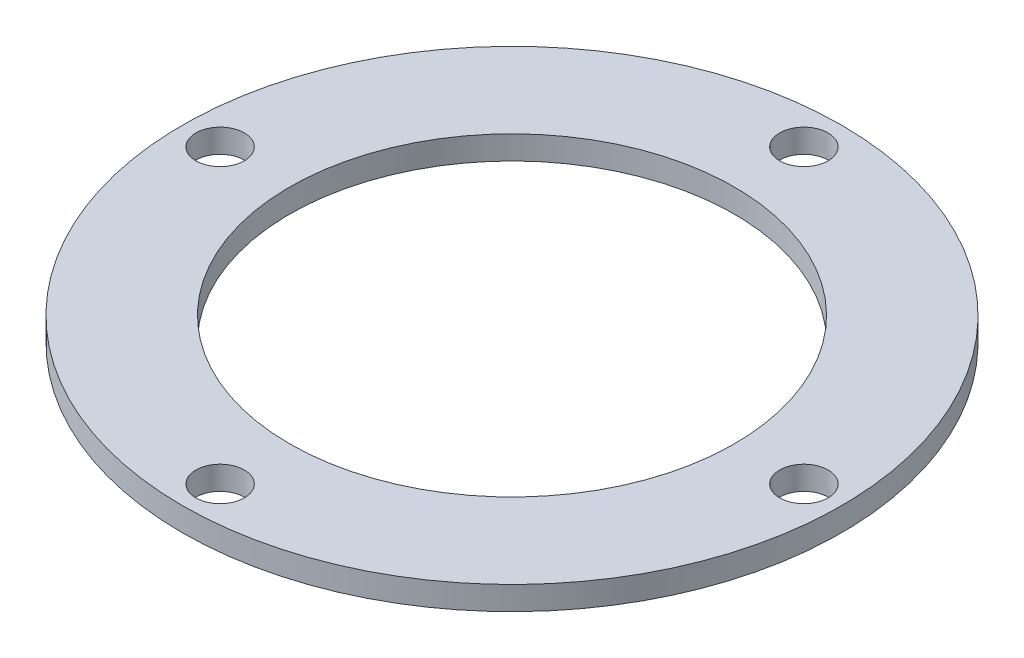
ISO-10303-21;
HEADER;
FILE_DESCRIPTION(('STEP AP214'),'2;1');
FILE_NAME('part.step','',(''),(''),'','','');
FILE_SCHEMA(('AUTOMOTIVE_DESIGN { 1 0 10303 214 1 1 1 1 }'));
ENDSEC;
DATA;
#1=APPLICATION_CONTEXT('core data for automotive mechanical design processes');
#2=APPLICATION_PROTOCOL_DEFINITION('international standard','automotive_design',2000,#1);
#3=PRODUCT_CONTEXT('',#1,'mechanical');
#4=PRODUCT('Part','Part','',(#3));
#5=PRODUCT_RELATED_PRODUCT_CATEGORY('part','',(#4));
#6=PRODUCT_DEFINITION_FORMATION('','',#4);
#7=PRODUCT_DEFINITION_CONTEXT('part definition',#1,'design');
#8=PRODUCT_DEFINITION('design','',#6,#7);
#9=PRODUCT_DEFINITION_SHAPE('','',#8);
#10=(LENGTH_UNIT() NAMED_UNIT(*) SI_UNIT(.MILLI.,.METRE.));
#11=(NAMED_UNIT(*) PLANE_ANGLE_UNIT() SI_UNIT($,.RADIAN.));
#12=(NAMED_UNIT(*) SI_UNIT($,.STERADIAN.) SOLID_ANGLE_UNIT());
#13=UNCERTAINTY_MEASURE_WITH_UNIT(LENGTH_MEASURE(1.E-05),#10,'distance_accuracy_value','');
#14=(GEOMETRIC_REPRESENTATION_CONTEXT(3) GLOBAL_UNCERTAINTY_ASSIGNED_CONTEXT((#13)) GLOBAL_UNIT_ASSIGNED_CONTEXT((#10,
#11,#12)) REPRESENTATION_CONTEXT('',''));
#15=CARTESIAN_POINT('',(0.,0.,0.));
#16=DIRECTION('',(0.,0.,1.));
#17=DIRECTION('',(1.,0.,0.));
#18=AXIS2_PLACEMENT_3D('',#15,#16,#17);
#19=CARTESIAN_POINT('',(0.,3.175,0.));
#20=DIRECTION('',(0.,1.,0.));
#21=DIRECTION('',(0.,0.,1.));
#22=AXIS2_PLACEMENT_3D('',#19,#20,#21);
#23=PLANE('',#22);
#24=CARTESIAN_POINT('',(0.,3.175,39.37));
#25=DIRECTION('',(0.,1.,0.));
#26=DIRECTION('',(0.,0.,1.));
#27=AXIS2_PLACEMENT_3D('',#24,#25,#26);
#28=CIRCLE('',#27,3.2639);
#29=CARTESIAN_POINT('',(0.,3.175,42.6339));
#30=VERTEX_POINT('',#29);
#31=EDGE_CURVE('E59',#30,#30,#28,.T.);
#32=ORIENTED_EDGE('',*,*,#31,.F.);
#33=EDGE_LOOP('',(#32));
#34=FACE_BOUND('',#33,.T.);
#35=CARTESIAN_POINT('',(0.,3.175,-39.37));
#36=DIRECTION('',(0.,1.,0.));
#37=DIRECTION('',(0.,0.,1.));
#38=AXIS2_PLACEMENT_3D('',#35,#36,#37);
#39=CIRCLE('',#38,3.2639);
#40=CARTESIAN_POINT('',(0.,3.175,-36.1061));
#41=VERTEX_POINT('',#40);
#42=EDGE_CURVE('E47',#41,#41,#39,.T.);
#43=ORIENTED_EDGE('',*,*,#42,.F.);
#44=EDGE_LOOP('',(#43));
#45=FACE_BOUND('',#44,.T.);
#46=CARTESIAN_POINT('',(0.,3.175,0.));
#47=DIRECTION('',(0.,1.,0.));
#48=DIRECTION('',(0.,0.,1.));
#49=AXIS2_PLACEMENT_3D('',#46,#47,#48);
#50=CIRCLE('',#49,44.45);
#51=CARTESIAN_POINT('',(0.,3.175,44.45));
#52=VERTEX_POINT('',#51);
#53=EDGE_CURVE('E10',#52,#52,#50,.T.);
#54=ORIENTED_EDGE('',*,*,#53,.T.);
#55=EDGE_LOOP('',(#54));
#56=FACE_BOUND('',#55,.T.);
#57=CARTESIAN_POINT('',(0.,3.175,0.));
#58=DIRECTION('',(0.,1.,0.));
#59=DIRECTION('',(0.,0.,1.));
#60=AXIS2_PLACEMENT_3D('',#57,#58,#59);
#61=CIRCLE('',#60,30.);
#62=CARTESIAN_POINT('',(0.,3.175,30.));
#63=VERTEX_POINT('',#62);
#64=EDGE_CURVE('E42',#63,#63,#61,.T.);
#65=ORIENTED_EDGE('',*,*,#64,.F.);
#66=EDGE_LOOP('',(#65));
#67=FACE_BOUND('',#66,.T.);
#68=CARTESIAN_POINT('',(39.37,3.175,0.));
#69=DIRECTION('',(0.,1.,0.));
#70=DIRECTION('',(0.,0.,1.));
#71=AXIS2_PLACEMENT_3D('',#68,#69,#70);
#72=CIRCLE('',#71,3.26390000000011);
#73=CARTESIAN_POINT('',(39.37,3.175,3.26390000000011));
#74=VERTEX_POINT('',#73);
#75=EDGE_CURVE('E53',#74,#74,#72,.T.);
#76=ORIENTED_EDGE('',*,*,#75,.F.);
#77=EDGE_LOOP('',(#76));
#78=FACE_BOUND('',#77,.T.);
#79=CARTESIAN_POINT('',(-39.37,3.175,0.));
#80=DIRECTION('',(0.,1.,0.));
#81=DIRECTION('',(0.,0.,1.));
#82=AXIS2_PLACEMENT_3D('',#79,#80,#81);
#83=CIRCLE('',#82,3.2639);
#84=CARTESIAN_POINT('',(-39.37,3.175,3.26390000000001));
#85=VERTEX_POINT('',#84);
#86=EDGE_CURVE('E65',#85,#85,#83,.T.);
#87=ORIENTED_EDGE('',*,*,#86,.F.);
#88=EDGE_LOOP('',(#87));
#89=FACE_BOUND('',#88,.T.);
#90=ADVANCED_FACE('F31',(#34,#45,#56,#67,#78,#89),#23,.T.);
#91=CARTESIAN_POINT('',(0.,0.,0.));
#92=DIRECTION('',(0.,1.,0.));
#93=DIRECTION('',(0.,0.,1.));
#94=AXIS2_PLACEMENT_3D('',#91,#92,#93);
#95=PLANE('',#94);
#96=CARTESIAN_POINT('',(0.,0.,0.));
#97=DIRECTION('',(0.,1.,0.));
#98=DIRECTION('',(0.,0.,1.));
#99=AXIS2_PLACEMENT_3D('',#96,#97,#98);
#100=CIRCLE('',#99,44.45);
#101=CARTESIAN_POINT('',(0.,0.,44.45));
#102=VERTEX_POINT('',#101);
#103=EDGE_CURVE('E35',#102,#102,#100,.T.);
#104=ORIENTED_EDGE('',*,*,#103,.F.);
#105=EDGE_LOOP('',(#104));
#106=FACE_BOUND('',#105,.T.);
#107=CARTESIAN_POINT('',(0.,0.,0.));
#108=DIRECTION('',(0.,1.,0.));
#109=DIRECTION('',(0.,0.,1.));
#110=AXIS2_PLACEMENT_3D('',#107,#108,#109);
#111=CIRCLE('',#110,30.);
#112=CARTESIAN_POINT('',(0.,0.,30.));
#113=VERTEX_POINT('',#112);
#114=EDGE_CURVE('E44',#113,#113,#111,.T.);
#115=ORIENTED_EDGE('',*,*,#114,.T.);
#116=EDGE_LOOP('',(#115));
#117=FACE_BOUND('',#116,.T.);
#118=CARTESIAN_POINT('',(0.,0.,-39.37));
#119=DIRECTION('',(0.,1.,0.));
#120=DIRECTION('',(0.,0.,1.));
#121=AXIS2_PLACEMENT_3D('',#118,#119,#120);
#122=CIRCLE('',#121,3.2639);
#123=CARTESIAN_POINT('',(0.,0.,-36.1061));
#124=VERTEX_POINT('',#123);
#125=EDGE_CURVE('E50',#124,#124,#122,.T.);
#126=ORIENTED_EDGE('',*,*,#125,.T.);
#127=EDGE_LOOP('',(#126));
#128=FACE_BOUND('',#127,.T.);
#129=CARTESIAN_POINT('',(39.37,0.,0.));
#130=DIRECTION('',(0.,1.,0.));
#131=DIRECTION('',(0.,0.,1.));
#132=AXIS2_PLACEMENT_3D('',#129,#130,#131);
#133=CIRCLE('',#132,3.26390000000011);
#134=CARTESIAN_POINT('',(39.37,0.,3.26390000000011));
#135=VERTEX_POINT('',#134);
#136=EDGE_CURVE('E56',#135,#135,#133,.T.);
#137=ORIENTED_EDGE('',*,*,#136,.T.);
#138=EDGE_LOOP('',(#137));
#139=FACE_BOUND('',#138,.T.);
#140=CARTESIAN_POINT('',(0.,0.,39.37));
#141=DIRECTION('',(0.,1.,0.));
#142=DIRECTION('',(0.,0.,1.));
#143=AXIS2_PLACEMENT_3D('',#140,#141,#142);
#144=CIRCLE('',#143,3.2639);
#145=CARTESIAN_POINT('',(0.,0.,42.6339));
#146=VERTEX_POINT('',#145);
#147=EDGE_CURVE('E62',#146,#146,#144,.T.);
#148=ORIENTED_EDGE('',*,*,#147,.T.);
#149=EDGE_LOOP('',(#148));
#150=FACE_BOUND('',#149,.T.);
#151=CARTESIAN_POINT('',(-39.37,0.,0.));
#152=DIRECTION('',(0.,1.,0.));
#153=DIRECTION('',(0.,0.,1.));
#154=AXIS2_PLACEMENT_3D('',#151,#152,#153);
#155=CIRCLE('',#154,3.2639);
#156=CARTESIAN_POINT('',(-39.37,0.,3.26390000000001));
#157=VERTEX_POINT('',#156);
#158=EDGE_CURVE('E68',#157,#157,#155,.T.);
#159=ORIENTED_EDGE('',*,*,#158,.T.);
#160=EDGE_LOOP('',(#159));
#161=FACE_BOUND('',#160,.T.);
#162=ADVANCED_FACE('F78',(#106,#117,#128,#139,#150,#161),#95,.F.);
#163=CARTESIAN_POINT('',(0.,3.175,0.));
#164=DIRECTION('',(0.,-1.,0.));
#165=DIRECTION('',(0.,0.,-1.));
#166=AXIS2_PLACEMENT_3D('',#163,#164,#165);
#167=CYLINDRICAL_SURFACE('',#166,44.45);
#168=ORIENTED_EDGE('',*,*,#53,.F.);
#169=EDGE_LOOP('',(#168));
#170=FACE_BOUND('',#169,.T.);
#171=ORIENTED_EDGE('',*,*,#103,.T.);
#172=EDGE_LOOP('',(#171));
#173=FACE_BOUND('',#172,.T.);
#174=ADVANCED_FACE('F33',(#170,#173),#167,.T.);
#175=CARTESIAN_POINT('',(0.,3.175,0.));
#176=DIRECTION('',(0.,-1.,0.));
#177=DIRECTION('',(0.,0.,-1.));
#178=AXIS2_PLACEMENT_3D('',#175,#176,#177);
#179=CYLINDRICAL_SURFACE('',#178,30.);
#180=ORIENTED_EDGE('',*,*,#64,.T.);
#181=EDGE_LOOP('',(#180));
#182=FACE_BOUND('',#181,.T.);
#183=ORIENTED_EDGE('',*,*,#114,.F.);
#184=EDGE_LOOP('',(#183));
#185=FACE_BOUND('',#184,.T.);
#186=ADVANCED_FACE('F88',(#182,#185),#179,.F.);
#187=CARTESIAN_POINT('',(0.,3.175,-39.37));
#188=DIRECTION('',(0.,-1.,0.));
#189=DIRECTION('',(0.,0.,-1.));
#190=AXIS2_PLACEMENT_3D('',#187,#188,#189);
#191=CYLINDRICAL_SURFACE('',#190,3.2639);
#192=ORIENTED_EDGE('',*,*,#42,.T.);
#193=EDGE_LOOP('',(#192));
#194=FACE_BOUND('',#193,.T.);
#195=ORIENTED_EDGE('',*,*,#125,.F.);
#196=EDGE_LOOP('',(#195));
#197=FACE_BOUND('',#196,.T.);
#198=ADVANCED_FACE('F91',(#194,#197),#191,.F.);
#199=CARTESIAN_POINT('',(39.37,3.175,0.));
#200=DIRECTION('',(0.,-1.,0.));
#201=DIRECTION('',(0.,0.,-1.));
#202=AXIS2_PLACEMENT_3D('',#199,#200,#201);
#203=CYLINDRICAL_SURFACE('',#202,3.26390000000011);
#204=ORIENTED_EDGE('',*,*,#75,.T.);
#205=EDGE_LOOP('',(#204));
#206=FACE_BOUND('',#205,.T.);
#207=ORIENTED_EDGE('',*,*,#136,.F.);
#208=EDGE_LOOP('',(#207));
#209=FACE_BOUND('',#208,.T.);
#210=ADVANCED_FACE('F95',(#206,#209),#203,.F.);
#211=CARTESIAN_POINT('',(0.,3.175,39.37));
#212=DIRECTION('',(0.,-1.,0.));
#213=DIRECTION('',(0.,0.,-1.));
#214=AXIS2_PLACEMENT_3D('',#211,#212,#213);
#215=CYLINDRICAL_SURFACE('',#214,3.2639);
#216=ORIENTED_EDGE('',*,*,#31,.T.);
#217=EDGE_LOOP('',(#216));
#218=FACE_BOUND('',#217,.T.);
#219=ORIENTED_EDGE('',*,*,#147,.F.);
#220=EDGE_LOOP('',(#219));
#221=FACE_BOUND('',#220,.T.);
#222=ADVANCED_FACE('F99',(#218,#221),#215,.F.);
#223=CARTESIAN_POINT('',(-39.37,3.175,0.));
#224=DIRECTION('',(0.,-1.,0.));
#225=DIRECTION('',(0.,0.,-1.));
#226=AXIS2_PLACEMENT_3D('',#223,#224,#225);
#227=CYLINDRICAL_SURFACE('',#226,3.2639);
#228=ORIENTED_EDGE('',*,*,#86,.T.);
#229=EDGE_LOOP('',(#228));
#230=FACE_BOUND('',#229,.T.);
#231=ORIENTED_EDGE('',*,*,#158,.F.);
#232=EDGE_LOOP('',(#231));
#233=FACE_BOUND('',#232,.T.);
#234=ADVANCED_FACE('F74',(#230,#233),#227,.F.);
#235=CLOSED_SHELL('',(#90,#162,#174,#186,#198,#210,#222,#234));
#236=MANIFOLD_SOLID_BREP('B2',#235);
#237=ADVANCED_BREP_SHAPE_REPRESENTATION('',(#18,#236),#14);
#238=SHAPE_DEFINITION_REPRESENTATION(#9,#237);
ENDSEC;
END-ISO-10303-21;
